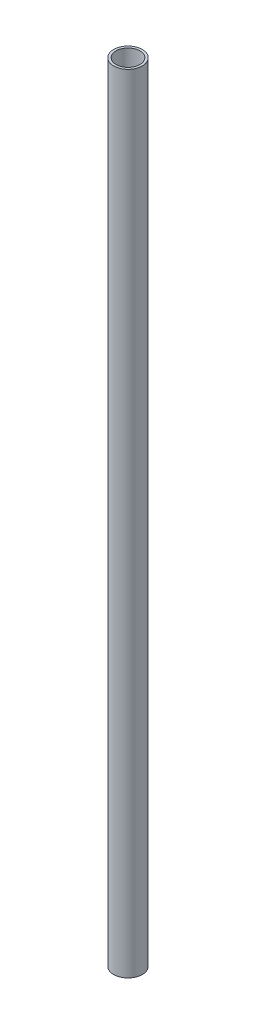
ISO-10303-21;
HEADER;
FILE_DESCRIPTION(('STEP AP214'),'2;1');
FILE_NAME('part.step','',(''),(''),'','','');
FILE_SCHEMA(('AUTOMOTIVE_DESIGN { 1 0 10303 214 1 1 1 1 }'));
ENDSEC;
DATA;
#1=APPLICATION_CONTEXT('core data for automotive mechanical design processes');
#2=APPLICATION_PROTOCOL_DEFINITION('international standard','automotive_design',2000,#1);
#3=PRODUCT_CONTEXT('',#1,'mechanical');
#4=PRODUCT('Part','Part','',(#3));
#5=PRODUCT_RELATED_PRODUCT_CATEGORY('part','',(#4));
#6=PRODUCT_DEFINITION_FORMATION('','',#4);
#7=PRODUCT_DEFINITION_CONTEXT('part definition',#1,'design');
#8=PRODUCT_DEFINITION('design','',#6,#7);
#9=PRODUCT_DEFINITION_SHAPE('','',#8);
#10=(LENGTH_UNIT() NAMED_UNIT(*) SI_UNIT(.MILLI.,.METRE.));
#11=(NAMED_UNIT(*) PLANE_ANGLE_UNIT() SI_UNIT($,.RADIAN.));
#12=(NAMED_UNIT(*) SI_UNIT($,.STERADIAN.) SOLID_ANGLE_UNIT());
#13=UNCERTAINTY_MEASURE_WITH_UNIT(LENGTH_MEASURE(1.E-05),#10,'distance_accuracy_value','');
#14=(GEOMETRIC_REPRESENTATION_CONTEXT(3) GLOBAL_UNCERTAINTY_ASSIGNED_CONTEXT((#13)) GLOBAL_UNIT_ASSIGNED_CONTEXT((#10,
#11,#12)) REPRESENTATION_CONTEXT('',''));
#15=CARTESIAN_POINT('',(0.,0.,0.));
#16=DIRECTION('',(0.,0.,1.));
#17=DIRECTION('',(1.,0.,0.));
#18=AXIS2_PLACEMENT_3D('',#15,#16,#17);
#19=CARTESIAN_POINT('',(0.,330.,0.));
#20=DIRECTION('',(0.,1.,0.));
#21=DIRECTION('',(0.,0.,1.));
#22=AXIS2_PLACEMENT_3D('',#19,#20,#21);
#23=PLANE('',#22);
#24=CARTESIAN_POINT('',(0.,330.,0.));
#25=DIRECTION('',(0.,1.,0.));
#26=DIRECTION('',(0.,0.,1.));
#27=AXIS2_PLACEMENT_3D('',#24,#25,#26);
#28=CIRCLE('',#27,6.);
#29=CARTESIAN_POINT('',(0.,330.,6.));
#30=VERTEX_POINT('',#29);
#31=EDGE_CURVE('E10',#30,#30,#28,.T.);
#32=ORIENTED_EDGE('',*,*,#31,.T.);
#33=EDGE_LOOP('',(#32));
#34=FACE_BOUND('',#33,.T.);
#35=CARTESIAN_POINT('',(0.,330.,0.));
#36=DIRECTION('',(0.,1.,0.));
#37=DIRECTION('',(0.,0.,1.));
#38=AXIS2_PLACEMENT_3D('',#35,#36,#37);
#39=CIRCLE('',#38,5.);
#40=CARTESIAN_POINT('',(0.,330.,5.));
#41=VERTEX_POINT('',#40);
#42=EDGE_CURVE('E56',#41,#41,#39,.T.);
#43=ORIENTED_EDGE('',*,*,#42,.F.);
#44=EDGE_LOOP('',(#43));
#45=FACE_BOUND('',#44,.T.);
#46=ADVANCED_FACE('F43',(#34,#45),#23,.T.);
#47=CARTESIAN_POINT('',(0.,0.,0.));
#48=DIRECTION('',(0.,1.,0.));
#49=DIRECTION('',(0.,0.,1.));
#50=AXIS2_PLACEMENT_3D('',#47,#48,#49);
#51=PLANE('',#50);
#52=CARTESIAN_POINT('',(0.,0.,0.));
#53=DIRECTION('',(0.,1.,0.));
#54=DIRECTION('',(0.,0.,1.));
#55=AXIS2_PLACEMENT_3D('',#52,#53,#54);
#56=CIRCLE('',#55,6.);
#57=CARTESIAN_POINT('',(0.,0.,6.));
#58=VERTEX_POINT('',#57);
#59=EDGE_CURVE('E47',#58,#58,#56,.T.);
#60=ORIENTED_EDGE('',*,*,#59,.F.);
#61=EDGE_LOOP('',(#60));
#62=FACE_BOUND('',#61,.T.);
#63=CARTESIAN_POINT('',(0.,0.,0.));
#64=DIRECTION('',(0.,1.,0.));
#65=DIRECTION('',(0.,0.,1.));
#66=AXIS2_PLACEMENT_3D('',#63,#64,#65);
#67=CIRCLE('',#66,5.);
#68=CARTESIAN_POINT('',(0.,0.,5.));
#69=VERTEX_POINT('',#68);
#70=EDGE_CURVE('E58',#69,#69,#67,.T.);
#71=ORIENTED_EDGE('',*,*,#70,.T.);
#72=EDGE_LOOP('',(#71));
#73=FACE_BOUND('',#72,.T.);
#74=ADVANCED_FACE('F70',(#62,#73),#51,.F.);
#75=CARTESIAN_POINT('',(0.,330.,0.));
#76=DIRECTION('',(0.,-1.,0.));
#77=DIRECTION('',(0.,0.,-1.));
#78=AXIS2_PLACEMENT_3D('',#75,#76,#77);
#79=CYLINDRICAL_SURFACE('',#78,6.);
#80=ORIENTED_EDGE('',*,*,#31,.F.);
#81=EDGE_LOOP('',(#80));
#82=FACE_BOUND('',#81,.T.);
#83=ORIENTED_EDGE('',*,*,#59,.T.);
#84=EDGE_LOOP('',(#83));
#85=FACE_BOUND('',#84,.T.);
#86=ADVANCED_FACE('F45',(#82,#85),#79,.T.);
#87=CARTESIAN_POINT('',(0.,330.,0.));
#88=DIRECTION('',(0.,-1.,0.));
#89=DIRECTION('',(0.,0.,-1.));
#90=AXIS2_PLACEMENT_3D('',#87,#88,#89);
#91=CYLINDRICAL_SURFACE('',#90,5.);
#92=ORIENTED_EDGE('',*,*,#42,.T.);
#93=EDGE_LOOP('',(#92));
#94=FACE_BOUND('',#93,.T.);
#95=ORIENTED_EDGE('',*,*,#70,.F.);
#96=EDGE_LOOP('',(#95));
#97=FACE_BOUND('',#96,.T.);
#98=ADVANCED_FACE('F66',(#94,#97),#91,.F.);
#99=CLOSED_SHELL('',(#46,#74,#86,#98));
#100=MANIFOLD_SOLID_BREP('B2',#99);
#101=ADVANCED_BREP_SHAPE_REPRESENTATION('',(#18,#100),#14);
#102=SHAPE_DEFINITION_REPRESENTATION(#9,#101);
ENDSEC;
END-ISO-10303-21;
